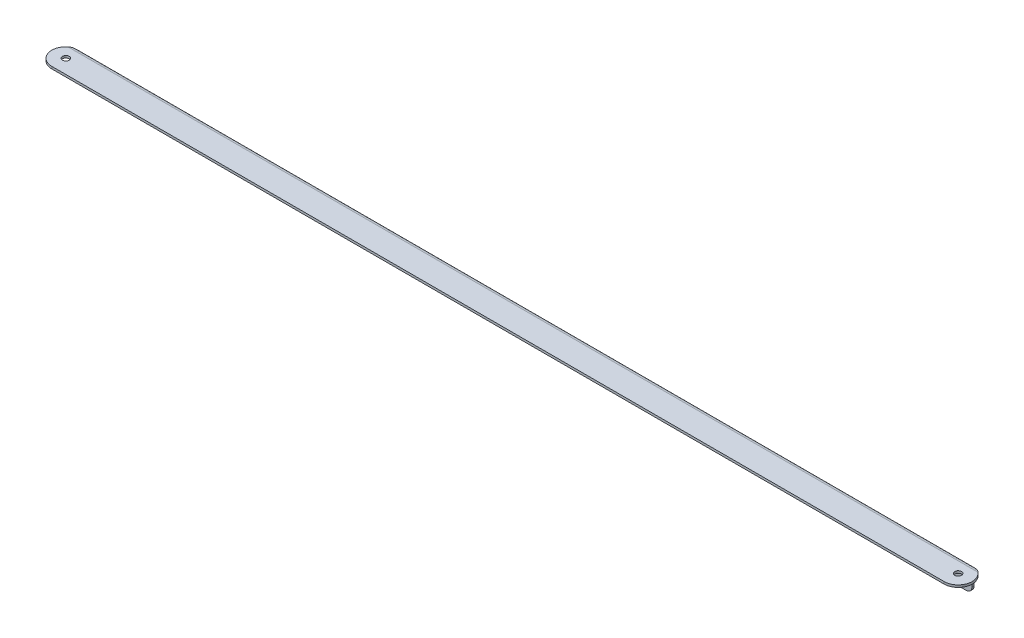
ISO-10303-21;
HEADER;
FILE_DESCRIPTION(('STEP AP214'),'2;1');
FILE_NAME('part.step','',(''),(''),'','','');
FILE_SCHEMA(('AUTOMOTIVE_DESIGN { 1 0 10303 214 1 1 1 1 }'));
ENDSEC;
DATA;
#1=APPLICATION_CONTEXT('core data for automotive mechanical design processes');
#2=APPLICATION_PROTOCOL_DEFINITION('international standard','automotive_design',2000,#1);
#3=PRODUCT_CONTEXT('',#1,'mechanical');
#4=PRODUCT('Part','Part','',(#3));
#5=PRODUCT_RELATED_PRODUCT_CATEGORY('part','',(#4));
#6=PRODUCT_DEFINITION_FORMATION('','',#4);
#7=PRODUCT_DEFINITION_CONTEXT('part definition',#1,'design');
#8=PRODUCT_DEFINITION('design','',#6,#7);
#9=PRODUCT_DEFINITION_SHAPE('','',#8);
#10=(LENGTH_UNIT() NAMED_UNIT(*) SI_UNIT(.MILLI.,.METRE.));
#11=(NAMED_UNIT(*) PLANE_ANGLE_UNIT() SI_UNIT($,.RADIAN.));
#12=(NAMED_UNIT(*) SI_UNIT($,.STERADIAN.) SOLID_ANGLE_UNIT());
#13=UNCERTAINTY_MEASURE_WITH_UNIT(LENGTH_MEASURE(1.E-05),#10,'distance_accuracy_value','');
#14=(GEOMETRIC_REPRESENTATION_CONTEXT(3) GLOBAL_UNCERTAINTY_ASSIGNED_CONTEXT((#13)) GLOBAL_UNIT_ASSIGNED_CONTEXT((#10,
#11,#12)) REPRESENTATION_CONTEXT('',''));
#15=CARTESIAN_POINT('',(0.,0.,0.));
#16=DIRECTION('',(0.,0.,1.));
#17=DIRECTION('',(1.,0.,0.));
#18=AXIS2_PLACEMENT_3D('',#15,#16,#17);
#19=CARTESIAN_POINT('',(-795.,3.00221285621761,24.5022128562179));
#20=DIRECTION('',(0.,-1.,0.));
#21=DIRECTION('',(1.,0.,0.));
#22=AXIS2_PLACEMENT_3D('',#19,#20,#21);
#23=PLANE('',#22);
#24=CARTESIAN_POINT('',(-795.,3.00221285621761,24.5022128562179));
#25=DIRECTION('',(0.,-1.,0.));
#26=DIRECTION('',(1.,0.,0.));
#27=AXIS2_PLACEMENT_3D('',#24,#25,#26);
#28=CIRCLE('',#27,5.99999999999999);
#29=CARTESIAN_POINT('',(-789.,3.00221285621761,24.5022128562179));
#30=VERTEX_POINT('',#29);
#31=EDGE_CURVE('E171',#30,#30,#28,.T.);
#32=ORIENTED_EDGE('',*,*,#31,.T.);
#33=EDGE_LOOP('',(#32));
#34=FACE_BOUND('',#33,.T.);
#35=CARTESIAN_POINT('',(795.,3.00221285621761,24.5022128562179));
#36=DIRECTION('',(0.,-1.,0.));
#37=DIRECTION('',(-1.,0.,0.));
#38=AXIS2_PLACEMENT_3D('',#35,#36,#37);
#39=CIRCLE('',#38,5.99999999999999);
#40=CARTESIAN_POINT('',(789.,3.00221285621761,24.5022128562179));
#41=VERTEX_POINT('',#40);
#42=EDGE_CURVE('E111',#41,#41,#39,.T.);
#43=ORIENTED_EDGE('',*,*,#42,.T.);
#44=EDGE_LOOP('',(#43));
#45=FACE_BOUND('',#44,.T.);
#46=CARTESIAN_POINT('',(795.,3.00221285621761,24.5022128562179));
#47=DIRECTION('',(0.,-1.,0.));
#48=DIRECTION('',(-1.,0.,0.));
#49=AXIS2_PLACEMENT_3D('',#46,#47,#48);
#50=CIRCLE('',#49,25.);
#51=CARTESIAN_POINT('',(810.641729242983,3.00221285621768,5.00000000000003));
#52=VERTEX_POINT('',#51);
#53=CARTESIAN_POINT('',(795.,3.00221285621752,49.5022128562179));
#54=VERTEX_POINT('',#53);
#55=EDGE_CURVE('E119',#52,#54,#50,.T.);
#56=ORIENTED_EDGE('',*,*,#55,.F.);
#57=DIRECTION('',(-1.,0.,0.));
#58=VECTOR('',#57,1.);
#59=CARTESIAN_POINT('',(-795.,3.00221285621768,5.00000000000003));
#60=LINE('',#59,#58);
#61=CARTESIAN_POINT('',(-810.641729242982,3.00221285621768,5.00000000000003));
#62=VERTEX_POINT('',#61);
#63=EDGE_CURVE('E101',#52,#62,#60,.T.);
#64=ORIENTED_EDGE('',*,*,#63,.T.);
#65=CARTESIAN_POINT('',(-795.,3.00221285621761,24.5022128562179));
#66=DIRECTION('',(0.,-1.,0.));
#67=DIRECTION('',(1.,0.,0.));
#68=AXIS2_PLACEMENT_3D('',#65,#66,#67);
#69=CIRCLE('',#68,25.);
#70=CARTESIAN_POINT('',(-795.,3.00221285621752,49.5022128562179));
#71=VERTEX_POINT('',#70);
#72=EDGE_CURVE('E117',#71,#62,#69,.T.);
#73=ORIENTED_EDGE('',*,*,#72,.F.);
#74=DIRECTION('',(-1.,0.,0.));
#75=VECTOR('',#74,1.);
#76=CARTESIAN_POINT('',(-795.,3.00221285621752,49.5022128562179));
#77=LINE('',#76,#75);
#78=EDGE_CURVE('E100',#54,#71,#77,.T.);
#79=ORIENTED_EDGE('',*,*,#78,.F.);
#80=EDGE_LOOP('',(#56,#64,#73,#79));
#81=FACE_BOUND('',#80,.T.);
#82=ADVANCED_FACE('F55',(#34,#45,#81),#23,.F.);
#83=CARTESIAN_POINT('',(-795.,3.00221285621761,24.5022128562179));
#84=DIRECTION('',(0.,-1.,0.));
#85=DIRECTION('',(1.,0.,0.));
#86=AXIS2_PLACEMENT_3D('',#83,#84,#85);
#87=CYLINDRICAL_SURFACE('',#86,25.);
#88=CARTESIAN_POINT('',(-810.641729242982,-0.997787143782323,5.00000000000003));
#89=CARTESIAN_POINT('',(-810.641729242982,3.00221285621768,5.00000000000006));
#90=B_SPLINE_CURVE_WITH_KNOTS('',1,(#88,#89),.UNSPECIFIED.,.F.,.F.,(2,2),(0.,1.),.UNSPECIFIED.);
#91=CARTESIAN_POINT('',(-810.641729242982,-0.997787143782323,5.00000000000003));
#92=VERTEX_POINT('',#91);
#93=EDGE_CURVE('E12',#92,#62,#90,.T.);
#94=ORIENTED_EDGE('',*,*,#93,.F.);
#95=CARTESIAN_POINT('',(-795.,-0.997787143782393,24.5022128562178));
#96=DIRECTION('',(0.,-1.,0.));
#97=DIRECTION('',(1.,0.,0.));
#98=AXIS2_PLACEMENT_3D('',#95,#96,#97);
#99=CIRCLE('',#98,25.);
#100=CARTESIAN_POINT('',(-795.,-0.99778714378248,49.5022128562179));
#101=VERTEX_POINT('',#100);
#102=EDGE_CURVE('E106',#101,#92,#99,.T.);
#103=ORIENTED_EDGE('',*,*,#102,.F.);
#104=DIRECTION('',(0.,-1.,0.));
#105=VECTOR('',#104,1.);
#106=CARTESIAN_POINT('',(-795.,3.00221285621752,49.5022128562179));
#107=LINE('',#106,#105);
#108=EDGE_CURVE('E82',#71,#101,#107,.T.);
#109=ORIENTED_EDGE('',*,*,#108,.F.);
#110=ORIENTED_EDGE('',*,*,#72,.T.);
#111=EDGE_LOOP('',(#94,#103,#109,#110));
#112=FACE_BOUND('',#111,.T.);
#113=ADVANCED_FACE('F57',(#112),#87,.T.);
#114=CARTESIAN_POINT('',(-795.,3.00221285621752,49.5022128562179));
#115=DIRECTION('',(0.,0.,1.));
#116=DIRECTION('',(0.,-1.,0.));
#117=AXIS2_PLACEMENT_3D('',#114,#115,#116);
#118=PLANE('',#117);
#119=DIRECTION('',(-1.,0.,0.));
#120=VECTOR('',#119,1.);
#121=CARTESIAN_POINT('',(-795.,-0.99778714378248,49.5022128562179));
#122=LINE('',#121,#120);
#123=CARTESIAN_POINT('',(795.,-0.99778714378248,49.5022128562179));
#124=VERTEX_POINT('',#123);
#125=EDGE_CURVE('E98',#124,#101,#122,.T.);
#126=ORIENTED_EDGE('',*,*,#125,.F.);
#127=DIRECTION('',(0.,-1.,0.));
#128=VECTOR('',#127,1.);
#129=CARTESIAN_POINT('',(795.,3.00221285621752,49.5022128562179));
#130=LINE('',#129,#128);
#131=EDGE_CURVE('E102',#54,#124,#130,.T.);
#132=ORIENTED_EDGE('',*,*,#131,.F.);
#133=ORIENTED_EDGE('',*,*,#78,.T.);
#134=ORIENTED_EDGE('',*,*,#108,.T.);
#135=EDGE_LOOP('',(#126,#132,#133,#134));
#136=FACE_BOUND('',#135,.T.);
#137=ADVANCED_FACE('F95',(#136),#118,.T.);
#138=CARTESIAN_POINT('',(795.,3.00221285621761,24.5022128562179));
#139=DIRECTION('',(0.,-1.,0.));
#140=DIRECTION('',(1.,0.,0.));
#141=AXIS2_PLACEMENT_3D('',#138,#139,#140);
#142=CYLINDRICAL_SURFACE('',#141,25.);
#143=CARTESIAN_POINT('',(810.641729242983,3.00221285621768,5.00000000000004));
#144=CARTESIAN_POINT('',(810.641729242983,-0.997787143782323,5.00000000000002));
#145=B_SPLINE_CURVE_WITH_KNOTS('',1,(#143,#144),.UNSPECIFIED.,.F.,.F.,(2,2),(0.,1.),.UNSPECIFIED.);
#146=CARTESIAN_POINT('',(810.641729242983,-0.997787143782323,5.00000000000002));
#147=VERTEX_POINT('',#146);
#148=EDGE_CURVE('E128',#52,#147,#145,.T.);
#149=ORIENTED_EDGE('',*,*,#148,.F.);
#150=ORIENTED_EDGE('',*,*,#55,.T.);
#151=ORIENTED_EDGE('',*,*,#131,.T.);
#152=CARTESIAN_POINT('',(795.,-0.997787143782393,24.5022128562178));
#153=DIRECTION('',(0.,-1.,0.));
#154=DIRECTION('',(-1.,0.,0.));
#155=AXIS2_PLACEMENT_3D('',#152,#153,#154);
#156=CIRCLE('',#155,25.);
#157=EDGE_CURVE('E110',#147,#124,#156,.T.);
#158=ORIENTED_EDGE('',*,*,#157,.F.);
#159=EDGE_LOOP('',(#149,#150,#151,#158));
#160=FACE_BOUND('',#159,.T.);
#161=ADVANCED_FACE('F145',(#160),#142,.T.);
#162=CARTESIAN_POINT('',(-795.,-0.997787143782393,24.5022128562178));
#163=DIRECTION('',(0.,-1.,0.));
#164=DIRECTION('',(1.,0.,0.));
#165=AXIS2_PLACEMENT_3D('',#162,#163,#164);
#166=PLANE('',#165);
#167=DIRECTION('',(-1.,0.,0.));
#168=VECTOR('',#167,1.);
#169=CARTESIAN_POINT('',(-795.,-0.997787143782325,4.99999999999999));
#170=LINE('',#169,#168);
#171=EDGE_CURVE('E66',#147,#92,#170,.T.);
#172=ORIENTED_EDGE('',*,*,#171,.F.);
#173=ORIENTED_EDGE('',*,*,#157,.T.);
#174=ORIENTED_EDGE('',*,*,#125,.T.);
#175=ORIENTED_EDGE('',*,*,#102,.T.);
#176=EDGE_LOOP('',(#172,#173,#174,#175));
#177=FACE_BOUND('',#176,.T.);
#178=CARTESIAN_POINT('',(-795.,-0.997787143782393,24.5022128562178));
#179=DIRECTION('',(0.,-1.,0.));
#180=DIRECTION('',(1.,0.,0.));
#181=AXIS2_PLACEMENT_3D('',#178,#179,#180);
#182=CIRCLE('',#181,5.99999999999999);
#183=CARTESIAN_POINT('',(-789.,-0.997787143782393,24.5022128562178));
#184=VERTEX_POINT('',#183);
#185=EDGE_CURVE('E326',#184,#184,#182,.T.);
#186=ORIENTED_EDGE('',*,*,#185,.F.);
#187=EDGE_LOOP('',(#186));
#188=FACE_BOUND('',#187,.T.);
#189=CARTESIAN_POINT('',(795.,-0.997787143782393,24.5022128562178));
#190=DIRECTION('',(0.,-1.,0.));
#191=DIRECTION('',(-1.,0.,0.));
#192=AXIS2_PLACEMENT_3D('',#189,#190,#191);
#193=CIRCLE('',#192,5.99999999999999);
#194=CARTESIAN_POINT('',(789.,-0.997787143782393,24.5022128562178));
#195=VERTEX_POINT('',#194);
#196=EDGE_CURVE('E325',#195,#195,#193,.T.);
#197=ORIENTED_EDGE('',*,*,#196,.F.);
#198=EDGE_LOOP('',(#197));
#199=FACE_BOUND('',#198,.T.);
#200=ADVANCED_FACE('F113',(#177,#188,#199),#166,.T.);
#201=CARTESIAN_POINT('',(795.,3.00221285621761,24.5022128562179));
#202=DIRECTION('',(0.,-1.,0.));
#203=DIRECTION('',(1.,0.,0.));
#204=AXIS2_PLACEMENT_3D('',#201,#202,#203);
#205=CYLINDRICAL_SURFACE('',#204,5.99999999999999);
#206=ORIENTED_EDGE('',*,*,#42,.F.);
#207=EDGE_LOOP('',(#206));
#208=FACE_BOUND('',#207,.T.);
#209=ORIENTED_EDGE('',*,*,#196,.T.);
#210=EDGE_LOOP('',(#209));
#211=FACE_BOUND('',#210,.T.);
#212=ADVANCED_FACE('F156',(#208,#211),#205,.F.);
#213=CARTESIAN_POINT('',(-795.,3.00221285621761,24.5022128562179));
#214=DIRECTION('',(0.,-1.,0.));
#215=DIRECTION('',(1.,0.,0.));
#216=AXIS2_PLACEMENT_3D('',#213,#214,#215);
#217=CYLINDRICAL_SURFACE('',#216,5.99999999999999);
#218=ORIENTED_EDGE('',*,*,#31,.F.);
#219=EDGE_LOOP('',(#218));
#220=FACE_BOUND('',#219,.T.);
#221=ORIENTED_EDGE('',*,*,#185,.T.);
#222=EDGE_LOOP('',(#221));
#223=FACE_BOUND('',#222,.T.);
#224=ADVANCED_FACE('F160',(#220,#223),#217,.F.);
#225=CARTESIAN_POINT('',(-785.,-30.5000000000002,-4.));
#226=DIRECTION('',(0.,0.,1.));
#227=DIRECTION('',(1.,0.,0.));
#228=AXIS2_PLACEMENT_3D('',#225,#226,#227);
#229=CYLINDRICAL_SURFACE('',#228,10.);
#230=CARTESIAN_POINT('',(-785.,-30.5000000000002,0.));
#231=DIRECTION('',(0.,0.,1.));
#232=DIRECTION('',(1.,0.,0.));
#233=AXIS2_PLACEMENT_3D('',#230,#231,#232);
#234=CIRCLE('',#233,10.);
#235=CARTESIAN_POINT('',(-795.,-30.5000000000002,0.));
#236=VERTEX_POINT('',#235);
#237=CARTESIAN_POINT('',(-785.,-40.5000000000002,0.));
#238=VERTEX_POINT('',#237);
#239=EDGE_CURVE('E359',#236,#238,#234,.T.);
#240=ORIENTED_EDGE('',*,*,#239,.F.);
#241=DIRECTION('',(0.,0.,1.));
#242=VECTOR('',#241,1.);
#243=CARTESIAN_POINT('',(-795.,-30.5000000000002,-4.));
#244=LINE('',#243,#242);
#245=CARTESIAN_POINT('',(-795.,-30.5000000000002,-4.));
#246=VERTEX_POINT('',#245);
#247=EDGE_CURVE('E329',#246,#236,#244,.T.);
#248=ORIENTED_EDGE('',*,*,#247,.F.);
#249=CARTESIAN_POINT('',(-785.,-30.5000000000002,-4.));
#250=DIRECTION('',(0.,0.,1.));
#251=DIRECTION('',(1.,0.,0.));
#252=AXIS2_PLACEMENT_3D('',#249,#250,#251);
#253=CIRCLE('',#252,10.);
#254=CARTESIAN_POINT('',(-785.,-40.5000000000002,-4.));
#255=VERTEX_POINT('',#254);
#256=EDGE_CURVE('E316',#246,#255,#253,.T.);
#257=ORIENTED_EDGE('',*,*,#256,.T.);
#258=DIRECTION('',(0.,0.,1.));
#259=VECTOR('',#258,1.);
#260=CARTESIAN_POINT('',(-785.,-40.5000000000002,-4.));
#261=LINE('',#260,#259);
#262=EDGE_CURVE('E320',#255,#238,#261,.T.);
#263=ORIENTED_EDGE('',*,*,#262,.T.);
#264=EDGE_LOOP('',(#240,#248,#257,#263));
#265=FACE_BOUND('',#264,.T.);
#266=ADVANCED_FACE('F393',(#265),#229,.T.);
#267=CARTESIAN_POINT('',(-785.,-40.5000000000002,-4.));
#268=DIRECTION('',(0.,-1.,0.));
#269=DIRECTION('',(0.,0.,-1.));
#270=AXIS2_PLACEMENT_3D('',#267,#268,#269);
#271=PLANE('',#270);
#272=DIRECTION('',(1.,0.,0.));
#273=VECTOR('',#272,1.);
#274=CARTESIAN_POINT('',(-785.,-40.5000000000002,0.));
#275=LINE('',#274,#273);
#276=CARTESIAN_POINT('',(785.,-40.5000000000002,0.));
#277=VERTEX_POINT('',#276);
#278=EDGE_CURVE('E356',#238,#277,#275,.T.);
#279=ORIENTED_EDGE('',*,*,#278,.F.);
#280=ORIENTED_EDGE('',*,*,#262,.F.);
#281=DIRECTION('',(1.,0.,0.));
#282=VECTOR('',#281,1.);
#283=CARTESIAN_POINT('',(-785.,-40.5000000000002,-4.));
#284=LINE('',#283,#282);
#285=CARTESIAN_POINT('',(785.,-40.5000000000002,-4.));
#286=VERTEX_POINT('',#285);
#287=EDGE_CURVE('E386',#255,#286,#284,.T.);
#288=ORIENTED_EDGE('',*,*,#287,.T.);
#289=DIRECTION('',(0.,0.,1.));
#290=VECTOR('',#289,1.);
#291=CARTESIAN_POINT('',(785.,-40.5000000000002,-4.));
#292=LINE('',#291,#290);
#293=EDGE_CURVE('E383',#286,#277,#292,.T.);
#294=ORIENTED_EDGE('',*,*,#293,.T.);
#295=EDGE_LOOP('',(#279,#280,#288,#294));
#296=FACE_BOUND('',#295,.T.);
#297=ADVANCED_FACE('F399',(#296),#271,.T.);
#298=CARTESIAN_POINT('',(785.,-30.5000000000002,-4.));
#299=DIRECTION('',(0.,0.,1.));
#300=DIRECTION('',(1.,0.,0.));
#301=AXIS2_PLACEMENT_3D('',#298,#299,#300);
#302=CYLINDRICAL_SURFACE('',#301,10.);
#303=CARTESIAN_POINT('',(785.,-30.5000000000002,0.));
#304=DIRECTION('',(0.,0.,1.));
#305=DIRECTION('',(-1.,0.,0.));
#306=AXIS2_PLACEMENT_3D('',#303,#304,#305);
#307=CIRCLE('',#306,10.);
#308=CARTESIAN_POINT('',(795.,-30.5000000000002,0.));
#309=VERTEX_POINT('',#308);
#310=EDGE_CURVE('E353',#277,#309,#307,.T.);
#311=ORIENTED_EDGE('',*,*,#310,.F.);
#312=ORIENTED_EDGE('',*,*,#293,.F.);
#313=CARTESIAN_POINT('',(785.,-30.5000000000002,-4.));
#314=DIRECTION('',(0.,0.,1.));
#315=DIRECTION('',(-1.,0.,0.));
#316=AXIS2_PLACEMENT_3D('',#313,#314,#315);
#317=CIRCLE('',#316,10.);
#318=CARTESIAN_POINT('',(795.,-30.5000000000002,-4.));
#319=VERTEX_POINT('',#318);
#320=EDGE_CURVE('E380',#286,#319,#317,.T.);
#321=ORIENTED_EDGE('',*,*,#320,.T.);
#322=DIRECTION('',(0.,0.,1.));
#323=VECTOR('',#322,1.);
#324=CARTESIAN_POINT('',(795.,-30.5000000000002,-4.));
#325=LINE('',#324,#323);
#326=EDGE_CURVE('E377',#319,#309,#325,.T.);
#327=ORIENTED_EDGE('',*,*,#326,.T.);
#328=EDGE_LOOP('',(#311,#312,#321,#327));
#329=FACE_BOUND('',#328,.T.);
#330=ADVANCED_FACE('F439',(#329),#302,.T.);
#331=CARTESIAN_POINT('',(-795.,24.4999999999998,-4.));
#332=DIRECTION('',(0.,0.,1.));
#333=DIRECTION('',(1.,0.,0.));
#334=AXIS2_PLACEMENT_3D('',#331,#332,#333);
#335=PLANE('',#334);
#336=DIRECTION('',(-1.,0.,0.));
#337=VECTOR('',#336,1.);
#338=CARTESIAN_POINT('',(-795.,-5.99778714378232,-4.));
#339=LINE('',#338,#337);
#340=CARTESIAN_POINT('',(795.,-5.99778714378232,-4.));
#341=VERTEX_POINT('',#340);
#342=CARTESIAN_POINT('',(-795.,-5.99778714378232,-4.));
#343=VERTEX_POINT('',#342);
#344=EDGE_CURVE('E313',#341,#343,#339,.T.);
#345=ORIENTED_EDGE('',*,*,#344,.F.);
#346=DIRECTION('',(0.,1.,0.));
#347=VECTOR('',#346,1.);
#348=CARTESIAN_POINT('',(795.,-0.500000000000202,-4.));
#349=LINE('',#348,#347);
#350=EDGE_CURVE('E374',#319,#341,#349,.T.);
#351=ORIENTED_EDGE('',*,*,#350,.F.);
#352=ORIENTED_EDGE('',*,*,#320,.F.);
#353=ORIENTED_EDGE('',*,*,#287,.F.);
#354=ORIENTED_EDGE('',*,*,#256,.F.);
#355=DIRECTION('',(0.,-1.,0.));
#356=VECTOR('',#355,1.);
#357=CARTESIAN_POINT('',(-795.,-0.500000000000202,-4.));
#358=LINE('',#357,#356);
#359=EDGE_CURVE('E337',#343,#246,#358,.T.);
#360=ORIENTED_EDGE('',*,*,#359,.F.);
#361=EDGE_LOOP('',(#345,#351,#352,#353,#354,#360));
#362=FACE_BOUND('',#361,.T.);
#363=ADVANCED_FACE('F436',(#362),#335,.F.);
#364=CARTESIAN_POINT('',(795.,-0.500000000000202,-4.));
#365=DIRECTION('',(1.,0.,0.));
#366=DIRECTION('',(0.,0.,-1.));
#367=AXIS2_PLACEMENT_3D('',#364,#365,#366);
#368=PLANE('',#367);
#369=ORIENTED_EDGE('',*,*,#350,.T.);
#370=DIRECTION('',(0.,0.,1.));
#371=VECTOR('',#370,1.);
#372=CARTESIAN_POINT('',(795.,-5.99778714378232,-4.00000000000004));
#373=LINE('',#372,#371);
#374=CARTESIAN_POINT('',(795.,-5.99778714378234,0.));
#375=VERTEX_POINT('',#374);
#376=EDGE_CURVE('E371',#341,#375,#373,.T.);
#377=ORIENTED_EDGE('',*,*,#376,.T.);
#378=DIRECTION('',(0.,1.,0.));
#379=VECTOR('',#378,1.);
#380=CARTESIAN_POINT('',(795.,-0.500000000000202,0.));
#381=LINE('',#380,#379);
#382=EDGE_CURVE('E368',#309,#375,#381,.T.);
#383=ORIENTED_EDGE('',*,*,#382,.F.);
#384=ORIENTED_EDGE('',*,*,#326,.F.);
#385=EDGE_LOOP('',(#369,#377,#383,#384));
#386=FACE_BOUND('',#385,.T.);
#387=ADVANCED_FACE('F431',(#386),#368,.T.);
#388=CARTESIAN_POINT('',(-795.,24.4999999999998,0.));
#389=DIRECTION('',(0.,0.,1.));
#390=DIRECTION('',(1.,0.,0.));
#391=AXIS2_PLACEMENT_3D('',#388,#389,#390);
#392=PLANE('',#391);
#393=ORIENTED_EDGE('',*,*,#382,.T.);
#394=DIRECTION('',(-1.,0.,0.));
#395=VECTOR('',#394,1.);
#396=CARTESIAN_POINT('',(-795.,-5.99778714378235,0.));
#397=LINE('',#396,#395);
#398=CARTESIAN_POINT('',(-795.,-5.99778714378232,0.));
#399=VERTEX_POINT('',#398);
#400=EDGE_CURVE('E365',#375,#399,#397,.T.);
#401=ORIENTED_EDGE('',*,*,#400,.T.);
#402=DIRECTION('',(0.,-1.,0.));
#403=VECTOR('',#402,1.);
#404=CARTESIAN_POINT('',(-795.,-0.500000000000202,0.));
#405=LINE('',#404,#403);
#406=EDGE_CURVE('E362',#399,#236,#405,.T.);
#407=ORIENTED_EDGE('',*,*,#406,.T.);
#408=ORIENTED_EDGE('',*,*,#239,.T.);
#409=ORIENTED_EDGE('',*,*,#278,.T.);
#410=ORIENTED_EDGE('',*,*,#310,.T.);
#411=EDGE_LOOP('',(#393,#401,#407,#408,#409,#410));
#412=FACE_BOUND('',#411,.T.);
#413=ADVANCED_FACE('F404',(#412),#392,.T.);
#414=CARTESIAN_POINT('',(-795.,-0.500000000000202,-4.));
#415=DIRECTION('',(-1.,0.,0.));
#416=DIRECTION('',(0.,0.,1.));
#417=AXIS2_PLACEMENT_3D('',#414,#415,#416);
#418=PLANE('',#417);
#419=ORIENTED_EDGE('',*,*,#406,.F.);
#420=DIRECTION('',(0.,0.,-1.));
#421=VECTOR('',#420,1.);
#422=CARTESIAN_POINT('',(-795.,-5.99778714378232,-4.00000000000004));
#423=LINE('',#422,#421);
#424=EDGE_CURVE('E345',#399,#343,#423,.T.);
#425=ORIENTED_EDGE('',*,*,#424,.T.);
#426=ORIENTED_EDGE('',*,*,#359,.T.);
#427=ORIENTED_EDGE('',*,*,#247,.T.);
#428=EDGE_LOOP('',(#419,#425,#426,#427));
#429=FACE_BOUND('',#428,.T.);
#430=ADVANCED_FACE('F408',(#429),#418,.T.);
#431=CARTESIAN_POINT('',(795.,-5.99778714378232,5.));
#432=DIRECTION('',(1.,0.,0.));
#433=DIRECTION('',(0.,0.,-1.));
#434=AXIS2_PLACEMENT_3D('',#431,#432,#433);
#435=PLANE('',#434);
#436=CARTESIAN_POINT('',(795.,-2.46225323784959,1.46446609406725));
#437=CARTESIAN_POINT('',(795.,0.36617388689659,-1.36396103067894));
#438=B_SPLINE_CURVE_WITH_KNOTS('',1,(#436,#437),.UNSPECIFIED.,.F.,.F.,(2,2),(0.,1.),.UNSPECIFIED.);
#439=CARTESIAN_POINT('',(795.,-2.46225323784959,1.46446609406725));
#440=VERTEX_POINT('',#439);
#441=CARTESIAN_POINT('',(795.,0.366173886896589,-1.36396103067894));
#442=VERTEX_POINT('',#441);
#443=EDGE_CURVE('E310',#440,#442,#438,.T.);
#444=ORIENTED_EDGE('',*,*,#443,.F.);
#445=CARTESIAN_POINT('',(795.,-5.99778714378232,5.));
#446=DIRECTION('',(1.,0.,0.));
#447=DIRECTION('',(0.,0.,-1.));
#448=AXIS2_PLACEMENT_3D('',#445,#446,#447);
#449=CIRCLE('',#448,5.);
#450=EDGE_CURVE('E212',#440,#375,#449,.F.);
#451=ORIENTED_EDGE('',*,*,#450,.T.);
#452=ORIENTED_EDGE('',*,*,#376,.F.);
#453=CARTESIAN_POINT('',(795.,-5.99778714378232,5.));
#454=DIRECTION('',(-1.,0.,0.));
#455=DIRECTION('',(0.,0.,-1.));
#456=AXIS2_PLACEMENT_3D('',#453,#454,#455);
#457=CIRCLE('',#456,9.);
#458=EDGE_CURVE('E213',#442,#341,#457,.T.);
#459=ORIENTED_EDGE('',*,*,#458,.F.);
#460=EDGE_LOOP('',(#444,#451,#452,#459));
#461=FACE_BOUND('',#460,.T.);
#462=ADVANCED_FACE('F427',(#461),#435,.T.);
#463=CARTESIAN_POINT('',(-795.,-5.99778714378232,5.));
#464=DIRECTION('',(-1.,0.,0.));
#465=DIRECTION('',(0.,0.,1.));
#466=AXIS2_PLACEMENT_3D('',#463,#464,#465);
#467=PLANE('',#466);
#468=ORIENTED_EDGE('',*,*,#424,.F.);
#469=CARTESIAN_POINT('',(-795.,-5.99778714378232,5.));
#470=DIRECTION('',(1.,0.,0.));
#471=DIRECTION('',(0.,0.,-1.));
#472=AXIS2_PLACEMENT_3D('',#469,#470,#471);
#473=CIRCLE('',#472,5.);
#474=CARTESIAN_POINT('',(-795.,-2.46225323784959,1.46446609406725));
#475=VERTEX_POINT('',#474);
#476=EDGE_CURVE('E245',#399,#475,#473,.T.);
#477=ORIENTED_EDGE('',*,*,#476,.T.);
#478=CARTESIAN_POINT('',(-795.,0.36617388689659,-1.36396103067894));
#479=CARTESIAN_POINT('',(-795.,-2.46225323784959,1.46446609406725));
#480=B_SPLINE_CURVE_WITH_KNOTS('',1,(#478,#479),.UNSPECIFIED.,.F.,.F.,(2,2),(0.,1.),.UNSPECIFIED.);
#481=CARTESIAN_POINT('',(-795.,0.36617388689659,-1.36396103067894));
#482=VERTEX_POINT('',#481);
#483=EDGE_CURVE('E307',#475,#482,#480,.F.);
#484=ORIENTED_EDGE('',*,*,#483,.T.);
#485=CARTESIAN_POINT('',(-795.,-5.99778714378232,5.));
#486=DIRECTION('',(1.,0.,0.));
#487=DIRECTION('',(0.,0.,1.));
#488=AXIS2_PLACEMENT_3D('',#485,#486,#487);
#489=CIRCLE('',#488,9.);
#490=EDGE_CURVE('E280',#343,#482,#489,.T.);
#491=ORIENTED_EDGE('',*,*,#490,.F.);
#492=EDGE_LOOP('',(#468,#477,#484,#491));
#493=FACE_BOUND('',#492,.T.);
#494=ADVANCED_FACE('F544',(#493),#467,.T.);
#495=CARTESIAN_POINT('',(-795.,0.36617388689659,-1.36396103067894));
#496=CARTESIAN_POINT('',(-796.5230501183,0.384770551079652,-1.34536436649588));
#497=CARTESIAN_POINT('',(-797.995409693205,0.51038878873265,-1.2247088829521));
#498=CARTESIAN_POINT('',(-800.127903670787,0.831051525038731,-0.864537585925404));
#499=CARTESIAN_POINT('',(-800.8260612975,0.959478168863625,-0.71414638835608));
#500=CARTESIAN_POINT('',(-802.197029152633,1.24765551867189,-0.344021912679421));
#501=CARTESIAN_POINT('',(-802.866841011443,1.4066828103826,-0.12540367495855));
#502=CARTESIAN_POINT('',(-804.193110809207,1.7415320623746,0.39577624798487));
#503=CARTESIAN_POINT('',(-804.840741368445,1.91308574975014,0.692110083033114));
#504=CARTESIAN_POINT('',(-805.788930697835,2.16065092564961,1.19541794203008));
#505=CARTESIAN_POINT('',(-806.101117722721,2.24150119972277,1.37297056353791));
#506=CARTESIAN_POINT('',(-806.563584132683,2.35787677373082,1.65437834884693));
#507=CARTESIAN_POINT('',(-806.716770581442,2.39584921783699,1.75069192344604));
#508=CARTESIAN_POINT('',(-806.94509672274,2.45125508676383,1.89895679273703));
#509=CARTESIAN_POINT('',(-807.020963181199,2.46946474152772,1.94901066171919));
#510=CARTESIAN_POINT('',(-807.134399485927,2.49634881454864,2.02504169284908));
#511=CARTESIAN_POINT('',(-807.172151023676,2.50523842708459,2.05054372920909));
#512=CARTESIAN_POINT('',(-807.22868748456,2.5184598918358,2.08903444431979));
#513=CARTESIAN_POINT('',(-807.247517830564,2.52284822044469,2.1019042919991));
#514=CARTESIAN_POINT('',(-807.275740638136,2.52940180118566,2.12126848550822));
#515=CARTESIAN_POINT('',(-807.285144455421,2.53158150936472,2.1277331202926));
#516=CARTESIAN_POINT('',(-807.303944519512,2.53593117566608,2.14068219782023));
#517=CARTESIAN_POINT('',(-807.316351088331,2.53879503360558,2.14924810506977));
#518=CARTESIAN_POINT('',(-807.731190159393,2.63441827736322,2.4360854595535));
#519=CARTESIAN_POINT('',(-808.212001626404,2.74533964536538,2.81123078580148));
#520=CARTESIAN_POINT('',(-809.318333631436,2.92928623686998,3.75889662776041));
#521=CARTESIAN_POINT('',(-809.943557339839,3.00221285621768,4.3320676706238));
#522=CARTESIAN_POINT('',(-810.641729242982,3.00221285621768,5.00000000000006));
#523=CARTESIAN_POINT('',(-795.,-2.46225323784959,1.46446609406725));
#524=CARTESIAN_POINT('',(-796.523051588405,-2.45192174777556,1.47479758414129));
#525=CARTESIAN_POINT('',(-797.995409693205,-2.38213384794067,1.54182839835995));
#526=CARTESIAN_POINT('',(-800.127903670787,-2.20398788332618,1.74192356337478));
#527=CARTESIAN_POINT('',(-800.8260612975,-2.13263974786791,1.82547422869107));
#528=CARTESIAN_POINT('',(-802.197029152633,-1.97254122019665,2.03109893740032));
#529=CARTESIAN_POINT('',(-802.866841011443,-1.88419272480181,2.15255351391192));
#530=CARTESIAN_POINT('',(-804.193110809207,-1.69816536258403,2.44209791554715));
#531=CARTESIAN_POINT('',(-804.840741368445,-1.60285775848651,2.60672782390729));
#532=CARTESIAN_POINT('',(-805.788930697835,-1.46532154965347,2.88634330112782));
#533=CARTESIAN_POINT('',(-806.101117722721,-1.42040473072394,2.98498364640995));
#534=CARTESIAN_POINT('',(-806.563584132683,-1.3557516340528,3.14132130491496));
#535=CARTESIAN_POINT('',(-806.716770581442,-1.3346558317716,3.19482884635891));
#536=CARTESIAN_POINT('',(-806.94509672274,-1.3038747934789,3.27719821818724));
#537=CARTESIAN_POINT('',(-807.020963181199,-1.29375831861007,3.30500592317733));
#538=CARTESIAN_POINT('',(-807.134399485927,-1.27882272248734,3.34724538491615));
#539=CARTESIAN_POINT('',(-807.172151023676,-1.27388404885626,3.36141318289394));
#540=CARTESIAN_POINT('',(-807.22868748456,-1.26653879066114,3.382796913511));
#541=CARTESIAN_POINT('',(-807.247517830564,-1.26410083032287,3.38994682888839));
#542=CARTESIAN_POINT('',(-807.275740638136,-1.26045995213344,3.40070471417123));
#543=CARTESIAN_POINT('',(-807.285144455421,-1.25924900314508,3.40429617794034));
#544=CARTESIAN_POINT('',(-807.303944519512,-1.25683252186654,3.41149010990013));
#545=CARTESIAN_POINT('',(-807.316351088331,-1.25524148967793,3.41624894726098));
#546=CARTESIAN_POINT('',(-807.731190159393,-1.20211746536813,3.57560303308528));
#547=CARTESIAN_POINT('',(-808.212001626404,-1.14049448314471,3.78401710322304));
#548=CARTESIAN_POINT('',(-809.318333631436,-1.03830193230882,4.31049812653356));
#549=CARTESIAN_POINT('',(-809.943717353843,-0.997787143782321,4.62901153001123));
#550=CARTESIAN_POINT('',(-810.641729242982,-0.997787143782323,5.00000000000003));
#551=B_SPLINE_SURFACE_WITH_KNOTS('',1,3,((#495,#496,#497,#498,#499,#500,#501,#502,#503,#504,
#505,#506,#507,#508,#509,#510,#511,#512,#513,#514,#515,#516,#517,#518,#519,#520,#521,#522),
(#523,#524,#525,#526,#527,#528,#529,#530,#531,#532,#533,#534,#535,#536,#537,#538,#539,#540,#541,
#542,#543,#544,#545,#546,#547,#548,#549,#550)),.UNSPECIFIED.,.F.,.F.,.F.,(2,2),(4,2,2,2,2,2,2,2,
2,2,2,2,2,4),(0.,1.),(0.,0.25,0.375,0.5,0.625,0.6875,0.71875,0.734375,0.7421875,0.74609375,
0.748046875,0.75,0.875,1.),.UNSPECIFIED.);
#552=CARTESIAN_POINT('',(-795.,-2.46225323784959,1.46446609406725));
#553=CARTESIAN_POINT('',(-796.523051588405,-2.45192174777556,1.47479758414129));
#554=CARTESIAN_POINT('',(-797.995409693205,-2.38213384794067,1.54182839835995));
#555=CARTESIAN_POINT('',(-800.127903670787,-2.20398788332618,1.74192356337478));
#556=CARTESIAN_POINT('',(-800.8260612975,-2.13263974786791,1.82547422869107));
#557=CARTESIAN_POINT('',(-802.197029152633,-1.97254122019665,2.03109893740032));
#558=CARTESIAN_POINT('',(-802.866841011443,-1.88419272480181,2.15255351391192));
#559=CARTESIAN_POINT('',(-804.193110809207,-1.69816536258403,2.44209791554715));
#560=CARTESIAN_POINT('',(-804.840741368445,-1.60285775848651,2.60672782390729));
#561=CARTESIAN_POINT('',(-805.788930697835,-1.46532154965347,2.88634330112782));
#562=CARTESIAN_POINT('',(-806.101117722721,-1.42040473072394,2.98498364640995));
#563=CARTESIAN_POINT('',(-806.563584132683,-1.3557516340528,3.14132130491496));
#564=CARTESIAN_POINT('',(-806.716770581442,-1.3346558317716,3.19482884635891));
#565=CARTESIAN_POINT('',(-806.94509672274,-1.3038747934789,3.27719821818724));
#566=CARTESIAN_POINT('',(-807.020963181199,-1.29375831861007,3.30500592317733));
#567=CARTESIAN_POINT('',(-807.134399485927,-1.27882272248734,3.34724538491615));
#568=CARTESIAN_POINT('',(-807.172151023676,-1.27388404885626,3.36141318289394));
#569=CARTESIAN_POINT('',(-807.22868748456,-1.26653879066114,3.382796913511));
#570=CARTESIAN_POINT('',(-807.247517830564,-1.26410083032287,3.38994682888839));
#571=CARTESIAN_POINT('',(-807.275740638136,-1.26045995213344,3.40070471417123));
#572=CARTESIAN_POINT('',(-807.285144455421,-1.25924900314508,3.40429617794034));
#573=CARTESIAN_POINT('',(-807.303944519512,-1.25683252186654,3.41149010990013));
#574=CARTESIAN_POINT('',(-807.316351088331,-1.25524148967793,3.41624894726098));
#575=CARTESIAN_POINT('',(-807.731190159393,-1.20211746536813,3.57560303308528));
#576=CARTESIAN_POINT('',(-808.212001626404,-1.14049448314471,3.78401710322304));
#577=CARTESIAN_POINT('',(-809.318333631436,-1.03830193230882,4.31049812653356));
#578=CARTESIAN_POINT('',(-809.943717353843,-0.997787143782321,4.62901153001123));
#579=CARTESIAN_POINT('',(-810.641729242982,-0.997787143782323,5.00000000000003));
#580=B_SPLINE_CURVE_WITH_KNOTS('',3,(#552,#553,#554,#555,#556,#557,#558,#559,#560,#561,#562,
#563,#564,#565,#566,#567,#568,#569,#570,#571,#572,#573,#574,#575,#576,#577,#578,#579),
.UNSPECIFIED.,.F.,.F.,(4,2,2,2,2,2,2,2,2,2,2,2,2,4),(0.,0.25,0.375,0.5,0.625,0.6875,0.71875,
0.734375,0.7421875,0.74609375,0.748046875,0.75,0.875,1.),.UNSPECIFIED.);
#581=EDGE_CURVE('E214',#475,#92,#580,.T.);
#582=CARTESIAN_POINT('',(-810.641729242982,3.00221285621768,5.00000000000006));
#583=CARTESIAN_POINT('',(-809.943557339839,3.00221285621768,4.3320676706238));
#584=CARTESIAN_POINT('',(-809.318333631436,2.92928623686998,3.75889662776041));
#585=CARTESIAN_POINT('',(-808.212001626404,2.74533964536538,2.81123078580148));
#586=CARTESIAN_POINT('',(-807.731190159393,2.63441827736322,2.4360854595535));
#587=CARTESIAN_POINT('',(-807.316351088331,2.53879503360558,2.14924810506977));
#588=CARTESIAN_POINT('',(-807.303944519512,2.53593117566608,2.14068219782023));
#589=CARTESIAN_POINT('',(-807.285144455421,2.53158150936472,2.1277331202926));
#590=CARTESIAN_POINT('',(-807.275740638136,2.52940180118566,2.12126848550822));
#591=CARTESIAN_POINT('',(-807.247517830564,2.52284822044469,2.1019042919991));
#592=CARTESIAN_POINT('',(-807.22868748456,2.5184598918358,2.08903444431979));
#593=CARTESIAN_POINT('',(-807.172151023676,2.50523842708459,2.05054372920909));
#594=CARTESIAN_POINT('',(-807.134399485927,2.49634881454864,2.02504169284908));
#595=CARTESIAN_POINT('',(-807.020963181199,2.46946474152772,1.94901066171919));
#596=CARTESIAN_POINT('',(-806.94509672274,2.45125508676383,1.89895679273703));
#597=CARTESIAN_POINT('',(-806.716770581442,2.39584921783699,1.75069192344604));
#598=CARTESIAN_POINT('',(-806.563584132683,2.35787677373082,1.65437834884693));
#599=CARTESIAN_POINT('',(-806.101117722721,2.24150119972277,1.37297056353791));
#600=CARTESIAN_POINT('',(-805.788930697835,2.16065092564961,1.19541794203008));
#601=CARTESIAN_POINT('',(-804.840741368445,1.91308574975014,0.692110083033114));
#602=CARTESIAN_POINT('',(-804.193110809207,1.7415320623746,0.39577624798487));
#603=CARTESIAN_POINT('',(-802.866841011443,1.4066828103826,-0.12540367495855));
#604=CARTESIAN_POINT('',(-802.197029152633,1.24765551867189,-0.344021912679421));
#605=CARTESIAN_POINT('',(-800.8260612975,0.959478168863625,-0.71414638835608));
#606=CARTESIAN_POINT('',(-800.127903670787,0.831051525038731,-0.864537585925404));
#607=CARTESIAN_POINT('',(-797.995409693205,0.51038878873265,-1.2247088829521));
#608=CARTESIAN_POINT('',(-796.5230501183,0.384770551079652,-1.34536436649588));
#609=CARTESIAN_POINT('',(-795.,0.36617388689659,-1.36396103067894));
#610=B_SPLINE_CURVE_WITH_KNOTS('',3,(#582,#583,#584,#585,#586,#587,#588,#589,#590,#591,#592,
#593,#594,#595,#596,#597,#598,#599,#600,#601,#602,#603,#604,#605,#606,#607,#608,#609),
.UNSPECIFIED.,.F.,.F.,(4,2,2,2,2,2,2,2,2,2,2,2,2,4),(0.,0.125,0.25,0.251953125,0.25390625,
0.2578125,0.265625,0.28125,0.3125,0.375,0.5,0.625,0.75,1.),.UNSPECIFIED.);
#611=EDGE_CURVE('E73',#482,#62,#610,.F.);
#612=ORIENTED_EDGE('',*,*,#483,.F.);
#613=ORIENTED_EDGE('',*,*,#581,.T.);
#614=ORIENTED_EDGE('',*,*,#93,.T.);
#615=ORIENTED_EDGE('',*,*,#611,.F.);
#616=EDGE_LOOP('',(#612,#613,#614,#615));
#617=FACE_BOUND('',#616,.T.);
#618=ADVANCED_FACE('F233',(#617),#551,.T.);
#619=CARTESIAN_POINT('',(810.641729242983,3.00221285621768,5.00000000000004));
#620=CARTESIAN_POINT('',(809.507156531655,3.00221285621768,3.86135680869153));
#621=CARTESIAN_POINT('',(808.349521733192,2.78929400185267,2.87388530123804));
#622=CARTESIAN_POINT('',(806.572234065421,2.37037030699737,1.65975591131028));
#623=CARTESIAN_POINT('',(805.973345727783,2.21357922740013,1.29844154556769));
#624=CARTESIAN_POINT('',(805.065324548755,1.97370252586463,0.818209639992313));
#625=CARTESIAN_POINT('',(804.76103604365,1.89291061089548,0.668380171744527));
#626=CARTESIAN_POINT('',(804.30218111785,1.77264259356418,0.458311762679601));
#627=CARTESIAN_POINT('',(804.148825781227,1.73270338897851,0.390733549859499));
#628=CARTESIAN_POINT('',(803.918187234255,1.67326286841833,0.292936479960116));
#629=CARTESIAN_POINT('',(803.841206794926,1.65352721692682,0.260932445953758));
#630=CARTESIAN_POINT('',(803.725584750422,1.62406919674828,0.213806407345661));
#631=CARTESIAN_POINT('',(803.687018838003,1.61427408775321,0.198244394242275));
#632=CARTESIAN_POINT('',(803.629132122996,1.59962124977245,0.175119796921225));
#633=CARTESIAN_POINT('',(803.609830243598,1.59474360730297,0.167448001421555));
#634=CARTESIAN_POINT('',(803.571213869343,1.58500216719262,0.152176953466177));
#635=CARTESIAN_POINT('',(803.554224477101,1.58072282125865,0.145487860650299));
#636=CARTESIAN_POINT('',(802.839909605398,1.40116836046456,-0.134130149956786));
#637=CARTESIAN_POINT('',(802.146852179848,1.23491994946207,-0.361507116795175));
#638=CARTESIAN_POINT('',(801.106683352948,1.01248390054793,-0.645401004362142));
#639=CARTESIAN_POINT('',(800.759863295885,0.94276631615666,-0.730503618004615));
#640=CARTESIAN_POINT('',(800.239487538147,0.846210108173603,-0.844843036966732));
#641=CARTESIAN_POINT('',(800.066004673545,0.815358056246835,-0.880736100146047));
#642=CARTESIAN_POINT('',(799.805743958604,0.771223473762579,-0.931357046125676));
#643=CARTESIAN_POINT('',(799.718984317284,0.756869001928404,-0.947694167761092));
#644=CARTESIAN_POINT('',(799.588835750796,0.735889106005393,-0.971408171700089));
#645=CARTESIAN_POINT('',(799.545451377882,0.728987764358415,-0.979180887283043));
#646=CARTESIAN_POINT('',(799.480372542383,0.718775612230242,-0.99064361579418));
#647=CARTESIAN_POINT('',(799.458679217862,0.715394870863785,-0.994431800762258));
#648=CARTESIAN_POINT('',(799.426138662049,0.710358957041613,-1.00006518580757));
#649=CARTESIAN_POINT('',(799.415291715273,0.708686185427924,-1.00193483206319));
#650=CARTESIAN_POINT('',(799.393597632043,0.70535241336094,-1.00565785915273));
#651=CARTESIAN_POINT('',(799.379998133491,0.703271451093031,-1.00797945484733));
#652=CARTESIAN_POINT('',(798.33576000743,0.543939167522862,-1.18561880289077));
#653=CARTESIAN_POINT('',(796.878456629723,0.429016236196118,-1.30111868137942));
#654=CARTESIAN_POINT('',(795.,0.36617388689659,-1.36396103067894));
#655=CARTESIAN_POINT('',(810.641729242983,-0.997787143782323,5.00000000000002));
#656=CARTESIAN_POINT('',(809.507888144585,-0.99778714378232,4.36782835911772));
#657=CARTESIAN_POINT('',(808.349521733192,-1.11607539620733,3.81882516735447));
#658=CARTESIAN_POINT('',(806.572234065421,-1.34881078223805,3.14430883961682));
#659=CARTESIAN_POINT('',(805.973345727783,-1.43591693756985,2.9435786364265));
#660=CARTESIAN_POINT('',(805.065324548755,-1.56918177175624,2.67678313332906));
#661=CARTESIAN_POINT('',(804.76103604365,-1.61406616896132,2.59354453985807));
#662=CARTESIAN_POINT('',(804.30218111785,-1.68088173414538,2.47683986815533));
#663=CARTESIAN_POINT('',(804.148825781227,-1.70307018113741,2.43929641658861));
#664=CARTESIAN_POINT('',(803.918187234255,-1.73609269255974,2.38496471108895));
#665=CARTESIAN_POINT('',(803.841206794926,-1.74705694338835,2.36718469219653));
#666=CARTESIAN_POINT('',(803.725584750422,-1.76342251015421,2.34100355963648));
#667=CARTESIAN_POINT('',(803.687018838003,-1.76886423737369,2.33235799680126));
#668=CARTESIAN_POINT('',(803.629132122996,-1.77700470291856,2.31951099828957));
#669=CARTESIAN_POINT('',(803.609830243598,-1.7797145042905,2.31524888967864));
#670=CARTESIAN_POINT('',(803.571213869343,-1.78512641546291,2.30676497414788));
#671=CARTESIAN_POINT('',(803.554224477101,-1.78750382987067,2.30304881147239));
#672=CARTESIAN_POINT('',(802.839909605398,-1.88725630808961,2.14770547224623));
#673=CARTESIAN_POINT('',(802.146852179848,-1.97961653642433,2.02138493511379));
#674=CARTESIAN_POINT('',(801.106683352948,-2.1031921191544,1.8636661086877));
#675=CARTESIAN_POINT('',(800.759863295885,-2.14192411048289,1.81638687888632));
#676=CARTESIAN_POINT('',(800.239487538147,-2.19556644825125,1.75286497946293));
#677=CARTESIAN_POINT('',(800.066004673545,-2.21270647709946,1.73292438880775));
#678=CARTESIAN_POINT('',(799.805743958604,-2.23722568959071,1.70480164104129));
#679=CARTESIAN_POINT('',(799.718984317284,-2.24520039616525,1.69572546235495));
#680=CARTESIAN_POINT('',(799.588835750796,-2.25685589390026,1.68255101572217));
#681=CARTESIAN_POINT('',(799.545451377882,-2.26068997259302,1.67823284039831));
#682=CARTESIAN_POINT('',(799.480372542383,-2.26636339044201,1.67186465789212));
#683=CARTESIAN_POINT('',(799.458679217862,-2.26824158009004,1.66976011068763));
#684=CARTESIAN_POINT('',(799.426138662049,-2.27103930999125,1.66663045232913));
#685=CARTESIAN_POINT('',(799.415291715273,-2.27196862755441,1.6655917599649));
#686=CARTESIAN_POINT('',(799.393597632043,-2.27382072314718,1.66352341158182));
#687=CARTESIAN_POINT('',(799.379998133491,-2.27497681329602,1.66223363619593));
#688=CARTESIAN_POINT('',(798.33576000743,-2.36349474861278,1.56354510950513));
#689=CARTESIAN_POINT('',(796.878458211569,-2.42734079217237,1.49937853974447));
#690=CARTESIAN_POINT('',(795.,-2.46225323784959,1.46446609406725));
#691=B_SPLINE_SURFACE_WITH_KNOTS('',1,3,((#619,#620,#621,#622,#623,#624,#625,#626,#627,#628,
#629,#630,#631,#632,#633,#634,#635,#636,#637,#638,#639,#640,#641,#642,#643,#644,#645,#646,#647,
#648,#649,#650,#651,#652,#653,#654),(#655,#656,#657,#658,#659,#660,#661,#662,#663,#664,#665,
#666,#667,#668,#669,#670,#671,#672,#673,#674,#675,#676,#677,#678,#679,#680,#681,#682,#683,#684,
#685,#686,#687,#688,#689,#690)),.UNSPECIFIED.,.F.,.F.,.F.,(2,2),(4,2,2,2,2,2,2,2,2,2,2,2,2,2,2,
2,2,4),(0.,1.),(0.,0.25,0.375,0.4375,0.46875,0.484375,0.4921875,0.49609375,0.5,0.625,0.6875,
0.71875,0.734375,0.7421875,0.74609375,0.748046875,0.75,1.),.UNSPECIFIED.);
#692=CARTESIAN_POINT('',(810.641729242983,-0.997787143782323,5.00000000000002));
#693=CARTESIAN_POINT('',(809.507888144585,-0.99778714378232,4.36782835911772));
#694=CARTESIAN_POINT('',(808.349521733192,-1.11607539620733,3.81882516735447));
#695=CARTESIAN_POINT('',(806.572234065421,-1.34881078223805,3.14430883961682));
#696=CARTESIAN_POINT('',(805.973345727783,-1.43591693756985,2.9435786364265));
#697=CARTESIAN_POINT('',(805.065324548755,-1.56918177175624,2.67678313332906));
#698=CARTESIAN_POINT('',(804.76103604365,-1.61406616896132,2.59354453985807));
#699=CARTESIAN_POINT('',(804.30218111785,-1.68088173414538,2.47683986815533));
#700=CARTESIAN_POINT('',(804.148825781227,-1.70307018113741,2.43929641658861));
#701=CARTESIAN_POINT('',(803.918187234255,-1.73609269255974,2.38496471108895));
#702=CARTESIAN_POINT('',(803.841206794926,-1.74705694338835,2.36718469219653));
#703=CARTESIAN_POINT('',(803.725584750422,-1.76342251015421,2.34100355963648));
#704=CARTESIAN_POINT('',(803.687018838003,-1.76886423737369,2.33235799680126));
#705=CARTESIAN_POINT('',(803.629132122996,-1.77700470291856,2.31951099828957));
#706=CARTESIAN_POINT('',(803.609830243598,-1.7797145042905,2.31524888967864));
#707=CARTESIAN_POINT('',(803.571213869343,-1.78512641546291,2.30676497414788));
#708=CARTESIAN_POINT('',(803.554224477101,-1.78750382987067,2.30304881147239));
#709=CARTESIAN_POINT('',(802.839909605398,-1.88725630808961,2.14770547224623));
#710=CARTESIAN_POINT('',(802.146852179848,-1.97961653642433,2.02138493511379));
#711=CARTESIAN_POINT('',(801.106683352948,-2.1031921191544,1.8636661086877));
#712=CARTESIAN_POINT('',(800.759863295885,-2.14192411048289,1.81638687888632));
#713=CARTESIAN_POINT('',(800.239487538147,-2.19556644825125,1.75286497946293));
#714=CARTESIAN_POINT('',(800.066004673545,-2.21270647709946,1.73292438880775));
#715=CARTESIAN_POINT('',(799.805743958604,-2.23722568959071,1.70480164104129));
#716=CARTESIAN_POINT('',(799.718984317284,-2.24520039616525,1.69572546235495));
#717=CARTESIAN_POINT('',(799.588835750796,-2.25685589390026,1.68255101572217));
#718=CARTESIAN_POINT('',(799.545451377882,-2.26068997259302,1.67823284039831));
#719=CARTESIAN_POINT('',(799.480372542383,-2.26636339044201,1.67186465789212));
#720=CARTESIAN_POINT('',(799.458679217862,-2.26824158009004,1.66976011068763));
#721=CARTESIAN_POINT('',(799.426138662049,-2.27103930999125,1.66663045232913));
#722=CARTESIAN_POINT('',(799.415291715273,-2.27196862755441,1.6655917599649));
#723=CARTESIAN_POINT('',(799.393597632043,-2.27382072314718,1.66352341158182));
#724=CARTESIAN_POINT('',(799.379998133491,-2.27497681329602,1.66223363619593));
#725=CARTESIAN_POINT('',(798.33576000743,-2.36349474861278,1.56354510950513));
#726=CARTESIAN_POINT('',(796.878458211569,-2.42734079217237,1.49937853974447));
#727=CARTESIAN_POINT('',(795.,-2.46225323784959,1.46446609406725));
#728=B_SPLINE_CURVE_WITH_KNOTS('',3,(#692,#693,#694,#695,#696,#697,#698,#699,#700,#701,#702,
#703,#704,#705,#706,#707,#708,#709,#710,#711,#712,#713,#714,#715,#716,#717,#718,#719,#720,#721,
#722,#723,#724,#725,#726,#727),.UNSPECIFIED.,.F.,.F.,(4,2,2,2,2,2,2,2,2,2,2,2,2,2,2,2,2,4),(0.,
0.25,0.375,0.4375,0.46875,0.484375,0.4921875,0.49609375,0.5,0.625,0.6875,0.71875,0.734375,
0.7421875,0.74609375,0.748046875,0.75,1.),.UNSPECIFIED.);
#729=EDGE_CURVE('E200',#147,#440,#728,.T.);
#730=CARTESIAN_POINT('',(795.,0.36617388689659,-1.36396103067894));
#731=CARTESIAN_POINT('',(796.878456629723,0.429016236196118,-1.30111868137942));
#732=CARTESIAN_POINT('',(798.33576000743,0.543939167522862,-1.18561880289077));
#733=CARTESIAN_POINT('',(799.379998133491,0.703271451093031,-1.00797945484733));
#734=CARTESIAN_POINT('',(799.393597632043,0.70535241336094,-1.00565785915273));
#735=CARTESIAN_POINT('',(799.415291715273,0.708686185427924,-1.00193483206319));
#736=CARTESIAN_POINT('',(799.426138662049,0.710358957041613,-1.00006518580757));
#737=CARTESIAN_POINT('',(799.458679217862,0.715394870863785,-0.994431800762258));
#738=CARTESIAN_POINT('',(799.480372542383,0.718775612230242,-0.99064361579418));
#739=CARTESIAN_POINT('',(799.545451377882,0.728987764358415,-0.979180887283043));
#740=CARTESIAN_POINT('',(799.588835750796,0.735889106005393,-0.971408171700089));
#741=CARTESIAN_POINT('',(799.718984317284,0.756869001928404,-0.947694167761092));
#742=CARTESIAN_POINT('',(799.805743958604,0.771223473762579,-0.931357046125676));
#743=CARTESIAN_POINT('',(800.066004673545,0.815358056246835,-0.880736100146047));
#744=CARTESIAN_POINT('',(800.239487538147,0.846210108173603,-0.844843036966732));
#745=CARTESIAN_POINT('',(800.759863295885,0.94276631615666,-0.730503618004615));
#746=CARTESIAN_POINT('',(801.106683352948,1.01248390054793,-0.645401004362142));
#747=CARTESIAN_POINT('',(802.146852179848,1.23491994946207,-0.361507116795175));
#748=CARTESIAN_POINT('',(802.839909605398,1.40116836046456,-0.134130149956786));
#749=CARTESIAN_POINT('',(803.554224477101,1.58072282125865,0.145487860650299));
#750=CARTESIAN_POINT('',(803.571213869343,1.58500216719262,0.152176953466177));
#751=CARTESIAN_POINT('',(803.609830243598,1.59474360730297,0.167448001421555));
#752=CARTESIAN_POINT('',(803.629132122996,1.59962124977245,0.175119796921225));
#753=CARTESIAN_POINT('',(803.687018838003,1.61427408775321,0.198244394242275));
#754=CARTESIAN_POINT('',(803.725584750422,1.62406919674828,0.213806407345661));
#755=CARTESIAN_POINT('',(803.841206794926,1.65352721692682,0.260932445953758));
#756=CARTESIAN_POINT('',(803.918187234255,1.67326286841833,0.292936479960116));
#757=CARTESIAN_POINT('',(804.148825781227,1.73270338897851,0.390733549859499));
#758=CARTESIAN_POINT('',(804.30218111785,1.77264259356418,0.458311762679601));
#759=CARTESIAN_POINT('',(804.76103604365,1.89291061089548,0.668380171744527));
#760=CARTESIAN_POINT('',(805.065324548755,1.97370252586463,0.818209639992313));
#761=CARTESIAN_POINT('',(805.973345727783,2.21357922740013,1.29844154556769));
#762=CARTESIAN_POINT('',(806.572234065421,2.37037030699737,1.65975591131028));
#763=CARTESIAN_POINT('',(808.349521733192,2.78929400185267,2.87388530123804));
#764=CARTESIAN_POINT('',(809.507156531655,3.00221285621768,3.86135680869153));
#765=CARTESIAN_POINT('',(810.641729242983,3.00221285621768,5.00000000000004));
#766=B_SPLINE_CURVE_WITH_KNOTS('',3,(#730,#731,#732,#733,#734,#735,#736,#737,#738,#739,#740,
#741,#742,#743,#744,#745,#746,#747,#748,#749,#750,#751,#752,#753,#754,#755,#756,#757,#758,#759,
#760,#761,#762,#763,#764,#765),.UNSPECIFIED.,.F.,.F.,(4,2,2,2,2,2,2,2,2,2,2,2,2,2,2,2,2,4),(0.,
0.25,0.251953125,0.25390625,0.2578125,0.265625,0.28125,0.3125,0.375,0.5,0.50390625,0.5078125,
0.515625,0.53125,0.5625,0.625,0.75,1.),.UNSPECIFIED.);
#767=EDGE_CURVE('E203',#52,#442,#766,.F.);
#768=ORIENTED_EDGE('',*,*,#729,.T.);
#769=ORIENTED_EDGE('',*,*,#443,.T.);
#770=ORIENTED_EDGE('',*,*,#767,.F.);
#771=ORIENTED_EDGE('',*,*,#148,.T.);
#772=EDGE_LOOP('',(#768,#769,#770,#771));
#773=FACE_BOUND('',#772,.T.);
#774=ADVANCED_FACE('F197',(#773),#691,.T.);
#775=CARTESIAN_POINT('',(-1621.32567839226,-5.99778714378232,5.));
#776=DIRECTION('',(1.,0.,0.));
#777=DIRECTION('',(0.,0.,-1.));
#778=AXIS2_PLACEMENT_3D('',#775,#776,#777);
#779=CYLINDRICAL_SURFACE('',#778,9.);
#780=ORIENTED_EDGE('',*,*,#63,.F.);
#781=ORIENTED_EDGE('',*,*,#767,.T.);
#782=ORIENTED_EDGE('',*,*,#458,.T.);
#783=ORIENTED_EDGE('',*,*,#344,.T.);
#784=ORIENTED_EDGE('',*,*,#490,.T.);
#785=ORIENTED_EDGE('',*,*,#611,.T.);
#786=EDGE_LOOP('',(#780,#781,#782,#783,#784,#785));
#787=FACE_BOUND('',#786,.T.);
#788=ADVANCED_FACE('F231',(#787),#779,.T.);
#789=CARTESIAN_POINT('',(-1621.32567839226,-5.99778714378232,5.));
#790=DIRECTION('',(1.,0.,0.));
#791=DIRECTION('',(0.,0.,-1.));
#792=AXIS2_PLACEMENT_3D('',#789,#790,#791);
#793=CYLINDRICAL_SURFACE('',#792,5.);
#794=ORIENTED_EDGE('',*,*,#171,.T.);
#795=ORIENTED_EDGE('',*,*,#581,.F.);
#796=ORIENTED_EDGE('',*,*,#476,.F.);
#797=ORIENTED_EDGE('',*,*,#400,.F.);
#798=ORIENTED_EDGE('',*,*,#450,.F.);
#799=ORIENTED_EDGE('',*,*,#729,.F.);
#800=EDGE_LOOP('',(#794,#795,#796,#797,#798,#799));
#801=FACE_BOUND('',#800,.T.);
#802=ADVANCED_FACE('F209',(#801),#793,.F.);
#803=CLOSED_SHELL('',(#82,#113,#137,#161,#200,#212,#224,#266,#297,#330,#363,#387,#413,#430,#462,
#494,#618,#774,#788,#802));
#804=MANIFOLD_SOLID_BREP('B2',#803);
#805=ADVANCED_BREP_SHAPE_REPRESENTATION('',(#18,#804),#14);
#806=SHAPE_DEFINITION_REPRESENTATION(#9,#805);
ENDSEC;
END-ISO-10303-21;
